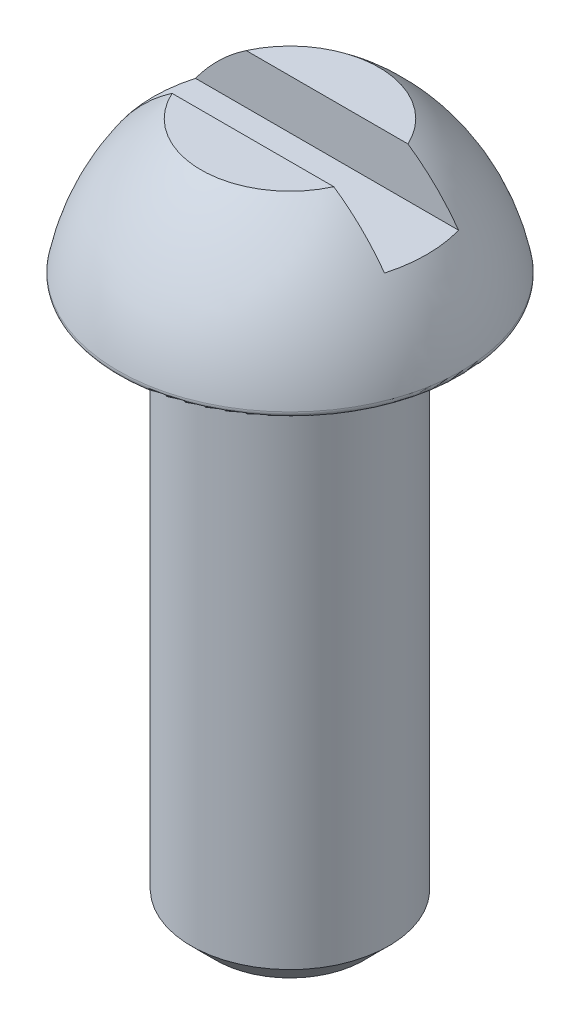
ISO-10303-21;
HEADER;
FILE_DESCRIPTION(('STEP AP214'),'2;1');
FILE_NAME('part.step','',(''),(''),'','','');
FILE_SCHEMA(('AUTOMOTIVE_DESIGN { 1 0 10303 214 1 1 1 1 }'));
ENDSEC;
DATA;
#1=APPLICATION_CONTEXT('core data for automotive mechanical design processes');
#2=APPLICATION_PROTOCOL_DEFINITION('international standard','automotive_design',2000,#1);
#3=PRODUCT_CONTEXT('',#1,'mechanical');
#4=PRODUCT('Part','Part','',(#3));
#5=PRODUCT_RELATED_PRODUCT_CATEGORY('part','',(#4));
#6=PRODUCT_DEFINITION_FORMATION('','',#4);
#7=PRODUCT_DEFINITION_CONTEXT('part definition',#1,'design');
#8=PRODUCT_DEFINITION('design','',#6,#7);
#9=PRODUCT_DEFINITION_SHAPE('','',#8);
#10=(LENGTH_UNIT() NAMED_UNIT(*) SI_UNIT(.MILLI.,.METRE.));
#11=(NAMED_UNIT(*) PLANE_ANGLE_UNIT() SI_UNIT($,.RADIAN.));
#12=(NAMED_UNIT(*) SI_UNIT($,.STERADIAN.) SOLID_ANGLE_UNIT());
#13=UNCERTAINTY_MEASURE_WITH_UNIT(LENGTH_MEASURE(1.E-05),#10,'distance_accuracy_value','');
#14=(GEOMETRIC_REPRESENTATION_CONTEXT(3) GLOBAL_UNCERTAINTY_ASSIGNED_CONTEXT((#13)) GLOBAL_UNIT_ASSIGNED_CONTEXT((#10,
#11,#12)) REPRESENTATION_CONTEXT('',''));
#15=CARTESIAN_POINT('',(0.,0.,0.));
#16=DIRECTION('',(0.,0.,1.));
#17=DIRECTION('',(1.,0.,0.));
#18=AXIS2_PLACEMENT_3D('',#15,#16,#17);
#19=CARTESIAN_POINT('',(0.,14.,0.));
#20=DIRECTION('',(0.,1.,0.));
#21=DIRECTION('',(0.,0.,1.));
#22=AXIS2_PLACEMENT_3D('',#19,#20,#21);
#23=PLANE('',#22);
#24=DIRECTION('',(-1.,0.,0.));
#25=VECTOR('',#24,1.);
#26=CARTESIAN_POINT('',(-4.,14.,-0.75));
#27=LINE('',#26,#25);
#28=CARTESIAN_POINT('',(1.63630681719536,14.,-0.75));
#29=VERTEX_POINT('',#28);
#30=CARTESIAN_POINT('',(-1.63630681719536,14.,-0.75));
#31=VERTEX_POINT('',#30);
#32=EDGE_CURVE('E83',#29,#31,#27,.T.);
#33=ORIENTED_EDGE('',*,*,#32,.F.);
#34=CARTESIAN_POINT('',(0.,14.,0.));
#35=DIRECTION('',(0.,-1.,0.));
#36=DIRECTION('',(0.,0.,-1.));
#37=AXIS2_PLACEMENT_3D('',#34,#35,#36);
#38=CIRCLE('',#37,1.8);
#39=EDGE_CURVE('E90',#31,#29,#38,.T.);
#40=ORIENTED_EDGE('',*,*,#39,.F.);
#41=EDGE_LOOP('',(#33,#40));
#42=FACE_BOUND('',#41,.T.);
#43=ADVANCED_FACE('F29',(#42),#23,.T.);
#44=CARTESIAN_POINT('',(1.5,0.,0.));
#45=DIRECTION('',(0.,-1.,0.));
#46=DIRECTION('',(0.,0.,-1.));
#47=AXIS2_PLACEMENT_3D('',#44,#45,#46);
#48=PLANE('',#47);
#49=CARTESIAN_POINT('',(0.,0.,0.));
#50=DIRECTION('',(0.,-1.,0.));
#51=DIRECTION('',(0.,0.,-1.));
#52=AXIS2_PLACEMENT_3D('',#49,#50,#51);
#53=CIRCLE('',#52,1.5);
#54=CARTESIAN_POINT('',(0.,0.,-1.5));
#55=VERTEX_POINT('',#54);
#56=EDGE_CURVE('E188',#55,#55,#53,.T.);
#57=ORIENTED_EDGE('',*,*,#56,.T.);
#58=EDGE_LOOP('',(#57));
#59=FACE_BOUND('',#58,.T.);
#60=ADVANCED_FACE('F31',(#59),#48,.T.);
#61=DIRECTION('',(1.,0.,0.));
#62=VECTOR('',#61,1.);
#63=CARTESIAN_POINT('',(-4.,14.,0.750000000000001));
#64=LINE('',#63,#62);
#65=CARTESIAN_POINT('',(-1.63630681719536,14.,0.75));
#66=VERTEX_POINT('',#65);
#67=CARTESIAN_POINT('',(1.63630681719536,14.,0.75));
#68=VERTEX_POINT('',#67);
#69=EDGE_CURVE('E74',#66,#68,#64,.T.);
#70=ORIENTED_EDGE('',*,*,#69,.F.);
#71=EDGE_CURVE('E82',#68,#66,#38,.T.);
#72=ORIENTED_EDGE('',*,*,#71,.F.);
#73=EDGE_LOOP('',(#70,#72));
#74=FACE_BOUND('',#73,.T.);
#75=ADVANCED_FACE('F81',(#74),#23,.T.);
#76=CARTESIAN_POINT('',(0.,10.480592167143,0.));
#77=DIRECTION('',(0.,-1.,0.));
#78=DIRECTION('',(0.,0.,-1.));
#79=AXIS2_PLACEMENT_3D('',#76,#77,#78);
#80=DEGENERATE_TOROIDAL_SURFACE('',#79,0.840789371764535,4.4,.F.);
#81=CARTESIAN_POINT('',(0.,14.582956019202,-0.75));
#82=CARTESIAN_POINT('',(-0.0580403365894685,14.5829593395836,-0.75));
#83=CARTESIAN_POINT('',(-0.116075308294297,14.5803208986943,-0.75));
#84=CARTESIAN_POINT('',(-0.231703825295864,14.5700507903085,-0.75));
#85=CARTESIAN_POINT('',(-0.289297267283977,14.5624179882653,-0.75));
#86=CARTESIAN_POINT('',(-0.404014123859632,14.5427255625741,-0.75));
#87=CARTESIAN_POINT('',(-0.461133551541633,14.5306431851174,-0.75));
#88=CARTESIAN_POINT('',(-0.574433896996379,14.5026978582504,-0.75));
#89=CARTESIAN_POINT('',(-0.630614657949977,14.4868342837577,-0.75));
#90=CARTESIAN_POINT('',(-0.77891142804328,14.4402237853859,-0.75));
#91=CARTESIAN_POINT('',(-0.870124449278167,14.4065875640343,-0.75));
#92=CARTESIAN_POINT('',(-1.04941203337837,14.3317851463396,-0.75));
#93=CARTESIAN_POINT('',(-1.13748498224243,14.2906151424381,-0.75));
#94=CARTESIAN_POINT('',(-1.31016932028902,14.201612321418,-0.75));
#95=CARTESIAN_POINT('',(-1.39478152209074,14.1537810801817,-0.75));
#96=CARTESIAN_POINT('',(-1.56027313132481,14.0520265606294,-0.75));
#97=CARTESIAN_POINT('',(-1.64115103467018,13.9981008572434,-0.75));
#98=CARTESIAN_POINT('',(-1.88564150957767,13.8221326577803,-0.75));
#99=CARTESIAN_POINT('',(-2.04242778065091,13.6903970240503,-0.75));
#100=CARTESIAN_POINT('',(-2.33504416247435,13.4057334825201,-0.75));
#101=CARTESIAN_POINT('',(-2.47088393151782,13.252815403923,-0.75));
#102=CARTESIAN_POINT('',(-2.73808918793351,12.9044589140908,-0.75));
#103=CARTESIAN_POINT('',(-2.86566034324544,12.7060883737321,-0.75));
#104=CARTESIAN_POINT('',(-3.08659995570262,12.291014147451,-0.75));
#105=CARTESIAN_POINT('',(-3.17994398310539,12.0742975021984,-0.75));
#106=CARTESIAN_POINT('',(-3.3316107625363,11.6234994690133,-0.75));
#107=CARTESIAN_POINT('',(-3.38910285580516,11.3891379783926,-0.75));
#108=CARTESIAN_POINT('',(-3.46413669819829,10.9141538695774,-0.75));
#109=CARTESIAN_POINT('',(-3.48168471936045,10.6735322403552,-0.75));
#110=CARTESIAN_POINT('',(-3.47636375112643,10.1914653190209,-0.75));
#111=CARTESIAN_POINT('',(-3.45328200753748,9.95002233821973,-0.75));
#112=CARTESIAN_POINT('',(-3.36691092575206,9.47438871675542,-0.75));
#113=CARTESIAN_POINT('',(-3.30361384354493,9.24019948201081,-0.75));
#114=CARTESIAN_POINT('',(-3.13853461690549,8.78576838284434,-0.75));
#115=CARTESIAN_POINT('',(-3.03674780230034,8.56552821472765,-0.75));
#116=CARTESIAN_POINT('',(-2.79748898455758,8.14543434530356,-0.75));
#117=CARTESIAN_POINT('',(-2.66002925682844,7.94557366409833,-0.75));
#118=CARTESIAN_POINT('',(-2.35398331518638,7.57312683166752,-0.75));
#119=CARTESIAN_POINT('',(-2.18556432603752,7.40040298083114,-0.75));
#120=CARTESIAN_POINT('',(-1.82115425247853,7.08622151872324,-0.75));
#121=CARTESIAN_POINT('',(-1.62514447486365,6.94478527377352,-0.75));
#122=CARTESIAN_POINT('',(-1.34776674340392,6.78090232308241,-0.75));
#123=CARTESIAN_POINT('',(-1.27608666405692,6.74151787639481,-0.75));
#124=CARTESIAN_POINT('',(-1.13031662931064,6.66752384040662,-0.75));
#125=CARTESIAN_POINT('',(-1.05622777805294,6.63291210047051,-0.75));
#126=CARTESIAN_POINT('',(-0.905939057170741,6.56903639211666,-0.75));
#127=CARTESIAN_POINT('',(-0.829743756807607,6.53976175661365,-0.75));
#128=CARTESIAN_POINT('',(-0.675322796693611,6.487276486063,-0.75));
#129=CARTESIAN_POINT('',(-0.597097546523169,6.46406463803318,-0.75));
#130=CARTESIAN_POINT('',(-0.400455115570391,6.41559239049113,-0.75));
#131=CARTESIAN_POINT('',(-0.280835490872069,6.39473521709551,-0.75));
#132=CARTESIAN_POINT('',(-0.100258332846962,6.37990687047812,-0.75));
#133=CARTESIAN_POINT('',(-0.0399425862774649,6.37770031288144,-0.75));
#134=CARTESIAN_POINT('',(0.0806433007261477,6.37897042047402,-0.75));
#135=CARTESIAN_POINT('',(0.140913432784944,6.38244795397452,-0.75));
#136=CARTESIAN_POINT('',(0.274323575007443,6.39608509237298,-0.75));
#137=CARTESIAN_POINT('',(0.347326105712831,6.40756561932451,-0.75));
#138=CARTESIAN_POINT('',(0.491980419278101,6.43714756303982,-0.75));
#139=CARTESIAN_POINT('',(0.563631290291078,6.45525329231733,-0.75));
#140=CARTESIAN_POINT('',(0.705783095763594,6.49705377559488,-0.75));
#141=CARTESIAN_POINT('',(0.776273170604393,6.52078500764333,-0.75));
#142=CARTESIAN_POINT('',(0.91545204558301,6.5729729004493,-0.75));
#143=CARTESIAN_POINT('',(0.984141068458322,6.60142897365993,-0.75));
#144=CARTESIAN_POINT('',(1.15197683814272,6.67715387648495,-0.75));
#145=CARTESIAN_POINT('',(1.25000641419588,6.7269178233559,-0.75));
#146=CARTESIAN_POINT('',(1.44148266277653,6.83457435685832,-0.75));
#147=CARTESIAN_POINT('',(1.5349275378867,6.89247009771191,-0.75));
#148=CARTESIAN_POINT('',(1.80720894369679,7.0769572681703,-0.75));
#149=CARTESIAN_POINT('',(1.97867428024067,7.21466444536891,-0.75));
#150=CARTESIAN_POINT('',(2.30057882359354,7.51755979602639,-0.75));
#151=CARTESIAN_POINT('',(2.45061872617133,7.68316879447205,-0.75));
#152=CARTESIAN_POINT('',(2.72303347864184,8.03594995610866,-0.75));
#153=CARTESIAN_POINT('',(2.84538854797858,8.22313739365556,-0.75));
#154=CARTESIAN_POINT('',(3.06694525374409,8.62796552242616,-0.75));
#155=CARTESIAN_POINT('',(3.16393546860489,8.84681977932326,-0.75));
#156=CARTESIAN_POINT('',(3.3202537241883,9.297569556064,-0.75));
#157=CARTESIAN_POINT('',(3.37958124435236,9.52946525611298,-0.75));
#158=CARTESIAN_POINT('',(3.45944916658007,10.0025601142315,-0.75));
#159=CARTESIAN_POINT('',(3.47954221342216,10.2438349406586,-0.75));
#160=CARTESIAN_POINT('',(3.47903920633119,10.7263695468672,-0.75));
#161=CARTESIAN_POINT('',(3.45843779474091,10.9676293204851,-0.75));
#162=CARTESIAN_POINT('',(3.37700227586657,11.4438580710861,-0.75));
#163=CARTESIAN_POINT('',(3.31607248015514,11.6788106998712,-0.75));
#164=CARTESIAN_POINT('',(3.15558147504914,12.1350583184714,-0.75));
#165=CARTESIAN_POINT('',(3.05603087364097,12.35635703928,-0.75));
#166=CARTESIAN_POINT('',(2.82125315986839,12.7785534755014,-0.75));
#167=CARTESIAN_POINT('',(2.68610201750678,12.9794933862572,-0.75));
#168=CARTESIAN_POINT('',(2.38359677259807,13.3556652638098,-0.75));
#169=CARTESIAN_POINT('',(2.21622040763453,13.5308793098386,-0.75));
#170=CARTESIAN_POINT('',(1.85550522686064,13.8482347710406,-0.75));
#171=CARTESIAN_POINT('',(1.66246393917611,13.9907105657179,-0.75));
#172=CARTESIAN_POINT('',(1.35618615550022,14.1766401580921,-0.75));
#173=CARTESIAN_POINT('',(1.25120826348287,14.2340240670664,-0.75));
#174=CARTESIAN_POINT('',(1.03617692562933,14.3383858147761,-0.75));
#175=CARTESIAN_POINT('',(0.926126764483635,14.3853702766773,-0.75));
#176=CARTESIAN_POINT('',(0.748333059865972,14.4498941980304,-0.75));
#177=CARTESIAN_POINT('',(0.68206704463818,14.4715455106505,-0.75));
#178=CARTESIAN_POINT('',(0.548103407540833,14.5099063592771,-0.75));
#179=CARTESIAN_POINT('',(0.480405994813529,14.5266166119508,-0.75));
#180=CARTESIAN_POINT('',(0.344277910119603,14.5540067439061,-0.75));
#181=CARTESIAN_POINT('',(0.27585593405004,14.5647288596414,-0.75));
#182=CARTESIAN_POINT('',(0.138286451791917,14.5791993697233,-0.75));
#183=CARTESIAN_POINT('',(0.0691394194295261,14.5829520638622,-0.75));
#184=CARTESIAN_POINT('',(0.,14.582956019202,-0.75));
#185=B_SPLINE_CURVE_WITH_KNOTS('',3,(#81,#82,#83,#84,#85,#86,#87,#88,#89,#90,#91,#92,#93,#94,
#95,#96,#97,#98,#99,#100,#101,#102,#103,#104,#105,#106,#107,#108,#109,#110,#111,#112,#113,#114,
#115,#116,#117,#118,#119,#120,#121,#122,#123,#124,#125,#126,#127,#128,#129,#130,#131,#132,#133,
#134,#135,#136,#137,#138,#139,#140,#141,#142,#143,#144,#145,#146,#147,#148,#149,#150,#151,#152,
#153,#154,#155,#156,#157,#158,#159,#160,#161,#162,#163,#164,#165,#166,#167,#168,#169,#170,#171,
#172,#173,#174,#175,#176,#177,#178,#179,#180,#181,#182,#183,#184),.UNSPECIFIED.,.T.,.F.,(4,2,2,
2,2,2,2,2,2,2,2,2,2,2,2,2,2,2,2,2,2,2,2,2,2,2,2,2,2,2,2,2,2,2,2,2,2,2,2,2,2,2,2,2,2,2,2,2,2,2,2,
4),(0.,0.174056495817506,0.348152545006498,0.523151520093731,0.698179444943365,
0.989399293553118,1.2807667326379,1.57206535819539,1.86348030631321,2.47536649095358,
3.0869696897974,3.79121267902729,4.49595735040306,5.21647654319957,5.93688259191074,
6.66107221349852,7.38540132993541,8.10981836145929,8.83398644356733,9.55435215458275,
10.2752082953845,10.5204514160815,10.7655836637898,11.0102204705775,11.2548082953121,
11.6172628854862,11.7980871690973,11.9789390783095,12.200253357451,12.4217119527328,
12.6446478738707,12.8675560930527,13.1968979589879,13.5263679271676,14.1830800928446,
14.8507678908608,15.5189312496778,16.2337190110351,16.9485166516853,17.6714179610551,
18.3944144508429,19.1191325965221,19.8436518244594,20.5666373119416,21.2901240693477,
22.0058556355985,22.364350143391,22.7226156731836,22.9316085776758,23.1405711542779,
23.3480406026555,23.5553820099578),.UNSPECIFIED.);
#186=CARTESIAN_POINT('',(-2.66290418993355,13.,-0.75));
#187=VERTEX_POINT('',#186);
#188=EDGE_CURVE('E11',#31,#187,#185,.T.);
#189=ORIENTED_EDGE('',*,*,#188,.F.);
#190=ORIENTED_EDGE('',*,*,#39,.T.);
#191=CARTESIAN_POINT('',(2.66290418993355,13.,-0.75));
#192=VERTEX_POINT('',#191);
#193=EDGE_CURVE('E33',#192,#29,#185,.T.);
#194=ORIENTED_EDGE('',*,*,#193,.F.);
#195=CARTESIAN_POINT('',(0.,13.,0.));
#196=DIRECTION('',(0.,1.,0.));
#197=DIRECTION('',(0.,0.,1.));
#198=AXIS2_PLACEMENT_3D('',#195,#196,#197);
#199=CIRCLE('',#198,2.76650659221438);
#200=CARTESIAN_POINT('',(2.66290418993355,13.,0.75));
#201=VERTEX_POINT('',#200);
#202=EDGE_CURVE('E102',#192,#201,#199,.F.);
#203=ORIENTED_EDGE('',*,*,#202,.T.);
#204=CARTESIAN_POINT('',(0.,14.582956019202,0.75));
#205=CARTESIAN_POINT('',(0.0580403365894685,14.5829593395836,0.75));
#206=CARTESIAN_POINT('',(0.116075308294297,14.5803208986943,0.75));
#207=CARTESIAN_POINT('',(0.231703825295865,14.5700507903085,0.75));
#208=CARTESIAN_POINT('',(0.289297267283977,14.5624179882653,0.75));
#209=CARTESIAN_POINT('',(0.404014123859633,14.5427255625741,0.75));
#210=CARTESIAN_POINT('',(0.461133551541634,14.5306431851174,0.75));
#211=CARTESIAN_POINT('',(0.57443389699638,14.5026978582504,0.75));
#212=CARTESIAN_POINT('',(0.630614657949978,14.4868342837577,0.75));
#213=CARTESIAN_POINT('',(0.77891142804328,14.4402237853859,0.75));
#214=CARTESIAN_POINT('',(0.870124449278167,14.4065875640343,0.75));
#215=CARTESIAN_POINT('',(1.04941203337837,14.3317851463396,0.75));
#216=CARTESIAN_POINT('',(1.13748498224243,14.2906151424381,0.75));
#217=CARTESIAN_POINT('',(1.31016932028902,14.201612321418,0.75));
#218=CARTESIAN_POINT('',(1.39478152209074,14.1537810801817,0.75));
#219=CARTESIAN_POINT('',(1.56027313132481,14.0520265606294,0.75));
#220=CARTESIAN_POINT('',(1.64115103467018,13.9981008572434,0.75));
#221=CARTESIAN_POINT('',(1.88564150957767,13.8221326577803,0.75));
#222=CARTESIAN_POINT('',(2.04242778065091,13.6903970240503,0.75));
#223=CARTESIAN_POINT('',(2.33504416247435,13.4057334825201,0.75));
#224=CARTESIAN_POINT('',(2.47088393151782,13.252815403923,0.75));
#225=CARTESIAN_POINT('',(2.73808918793351,12.9044589140908,0.75));
#226=CARTESIAN_POINT('',(2.86566034324544,12.7060883737321,0.75));
#227=CARTESIAN_POINT('',(3.08659995570262,12.291014147451,0.75));
#228=CARTESIAN_POINT('',(3.17994398310539,12.0742975021984,0.75));
#229=CARTESIAN_POINT('',(3.3316107625363,11.6234994690133,0.75));
#230=CARTESIAN_POINT('',(3.38910285580516,11.3891379783926,0.75));
#231=CARTESIAN_POINT('',(3.46413669819829,10.9141538695774,0.75));
#232=CARTESIAN_POINT('',(3.48168471936045,10.6735322403552,0.75));
#233=CARTESIAN_POINT('',(3.47636375112643,10.1914653190209,0.75));
#234=CARTESIAN_POINT('',(3.45328200753748,9.95002233821973,0.75));
#235=CARTESIAN_POINT('',(3.36691092575206,9.47438871675542,0.75));
#236=CARTESIAN_POINT('',(3.30361384354493,9.24019948201081,0.75));
#237=CARTESIAN_POINT('',(3.13853461690549,8.78576838284434,0.75));
#238=CARTESIAN_POINT('',(3.03674780230034,8.56552821472765,0.75));
#239=CARTESIAN_POINT('',(2.79748898455758,8.14543434530356,0.75));
#240=CARTESIAN_POINT('',(2.66002925682844,7.94557366409833,0.75));
#241=CARTESIAN_POINT('',(2.35398331518638,7.57312683166752,0.75));
#242=CARTESIAN_POINT('',(2.18556432603752,7.40040298083114,0.75));
#243=CARTESIAN_POINT('',(1.82115425247853,7.08622151872324,0.75));
#244=CARTESIAN_POINT('',(1.62514447486365,6.94478527377352,0.75));
#245=CARTESIAN_POINT('',(1.34776674340392,6.78090232308241,0.75));
#246=CARTESIAN_POINT('',(1.27608666405692,6.74151787639481,0.75));
#247=CARTESIAN_POINT('',(1.13031662931064,6.66752384040662,0.75));
#248=CARTESIAN_POINT('',(1.05622777805294,6.63291210047051,0.75));
#249=CARTESIAN_POINT('',(0.905939057170741,6.56903639211665,0.75));
#250=CARTESIAN_POINT('',(0.829743756807607,6.53976175661365,0.75));
#251=CARTESIAN_POINT('',(0.675322796693611,6.487276486063,0.75));
#252=CARTESIAN_POINT('',(0.597097546523169,6.46406463803318,0.75));
#253=CARTESIAN_POINT('',(0.40045511557039,6.41559239049113,0.75));
#254=CARTESIAN_POINT('',(0.280835490872069,6.39473521709551,0.75));
#255=CARTESIAN_POINT('',(0.100258332846961,6.37990687047812,0.75));
#256=CARTESIAN_POINT('',(0.0399425862774647,6.37770031288144,0.75));
#257=CARTESIAN_POINT('',(-0.0806433007261479,6.37897042047402,0.75));
#258=CARTESIAN_POINT('',(-0.140913432784944,6.38244795397452,0.75));
#259=CARTESIAN_POINT('',(-0.274323575007443,6.39608509237298,0.75));
#260=CARTESIAN_POINT('',(-0.347326105712832,6.40756561932451,0.75));
#261=CARTESIAN_POINT('',(-0.491980419278101,6.43714756303982,0.75));
#262=CARTESIAN_POINT('',(-0.563631290291079,6.45525329231733,0.75));
#263=CARTESIAN_POINT('',(-0.705783095763594,6.49705377559488,0.75));
#264=CARTESIAN_POINT('',(-0.776273170604393,6.52078500764333,0.75));
#265=CARTESIAN_POINT('',(-0.91545204558301,6.5729729004493,0.75));
#266=CARTESIAN_POINT('',(-0.984141068458322,6.60142897365993,0.75));
#267=CARTESIAN_POINT('',(-1.15197683814272,6.67715387648495,0.75));
#268=CARTESIAN_POINT('',(-1.25000641419588,6.7269178233559,0.75));
#269=CARTESIAN_POINT('',(-1.44148266277653,6.83457435685832,0.75));
#270=CARTESIAN_POINT('',(-1.53492753788671,6.89247009771191,0.75));
#271=CARTESIAN_POINT('',(-1.80720894369679,7.0769572681703,0.75));
#272=CARTESIAN_POINT('',(-1.97867428024067,7.21466444536891,0.75));
#273=CARTESIAN_POINT('',(-2.30057882359354,7.51755979602639,0.75));
#274=CARTESIAN_POINT('',(-2.45061872617133,7.68316879447205,0.75));
#275=CARTESIAN_POINT('',(-2.72303347864184,8.03594995610866,0.75));
#276=CARTESIAN_POINT('',(-2.84538854797858,8.22313739365556,0.75));
#277=CARTESIAN_POINT('',(-3.0669452537441,8.62796552242616,0.75));
#278=CARTESIAN_POINT('',(-3.16393546860489,8.84681977932326,0.75));
#279=CARTESIAN_POINT('',(-3.3202537241883,9.297569556064,0.75));
#280=CARTESIAN_POINT('',(-3.37958124435236,9.52946525611298,0.75));
#281=CARTESIAN_POINT('',(-3.45944916658007,10.0025601142315,0.75));
#282=CARTESIAN_POINT('',(-3.47954221342216,10.2438349406586,0.75));
#283=CARTESIAN_POINT('',(-3.47903920633119,10.7263695468672,0.75));
#284=CARTESIAN_POINT('',(-3.45843779474091,10.9676293204851,0.75));
#285=CARTESIAN_POINT('',(-3.37700227586657,11.4438580710861,0.75));
#286=CARTESIAN_POINT('',(-3.31607248015514,11.6788106998712,0.75));
#287=CARTESIAN_POINT('',(-3.15558147504914,12.1350583184714,0.75));
#288=CARTESIAN_POINT('',(-3.05603087364097,12.35635703928,0.75));
#289=CARTESIAN_POINT('',(-2.82125315986839,12.7785534755014,0.75));
#290=CARTESIAN_POINT('',(-2.68610201750677,12.9794933862572,0.75));
#291=CARTESIAN_POINT('',(-2.38359677259806,13.3556652638098,0.75));
#292=CARTESIAN_POINT('',(-2.21622040763452,13.5308793098386,0.75));
#293=CARTESIAN_POINT('',(-1.85550522686063,13.8482347710406,0.75));
#294=CARTESIAN_POINT('',(-1.66246393917611,13.9907105657179,0.75));
#295=CARTESIAN_POINT('',(-1.35618615550022,14.1766401580921,0.75));
#296=CARTESIAN_POINT('',(-1.25120826348287,14.2340240670664,0.75));
#297=CARTESIAN_POINT('',(-1.03617692562933,14.3383858147761,0.75));
#298=CARTESIAN_POINT('',(-0.926126764483635,14.3853702766773,0.75));
#299=CARTESIAN_POINT('',(-0.748333059865972,14.4498941980304,0.75));
#300=CARTESIAN_POINT('',(-0.682067044638181,14.4715455106505,0.75));
#301=CARTESIAN_POINT('',(-0.548103407540834,14.5099063592771,0.75));
#302=CARTESIAN_POINT('',(-0.480405994813531,14.5266166119508,0.75));
#303=CARTESIAN_POINT('',(-0.344277910119603,14.5540067439061,0.75));
#304=CARTESIAN_POINT('',(-0.27585593405004,14.5647288596414,0.75));
#305=CARTESIAN_POINT('',(-0.138286451791917,14.5791993697233,0.75));
#306=CARTESIAN_POINT('',(-0.0691394194295258,14.5829520638622,0.75));
#307=CARTESIAN_POINT('',(0.,14.582956019202,0.75));
#308=B_SPLINE_CURVE_WITH_KNOTS('',3,(#204,#205,#206,#207,#208,#209,#210,#211,#212,#213,#214,
#215,#216,#217,#218,#219,#220,#221,#222,#223,#224,#225,#226,#227,#228,#229,#230,#231,#232,#233,
#234,#235,#236,#237,#238,#239,#240,#241,#242,#243,#244,#245,#246,#247,#248,#249,#250,#251,#252,
#253,#254,#255,#256,#257,#258,#259,#260,#261,#262,#263,#264,#265,#266,#267,#268,#269,#270,#271,
#272,#273,#274,#275,#276,#277,#278,#279,#280,#281,#282,#283,#284,#285,#286,#287,#288,#289,#290,
#291,#292,#293,#294,#295,#296,#297,#298,#299,#300,#301,#302,#303,#304,#305,#306,#307),
.UNSPECIFIED.,.T.,.F.,(4,2,2,2,2,2,2,2,2,2,2,2,2,2,2,2,2,2,2,2,2,2,2,2,2,2,2,2,2,2,2,2,2,2,2,2,
2,2,2,2,2,2,2,2,2,2,2,2,2,2,2,4),(0.,0.174056495817506,0.348152545006498,0.523151520093731,
0.698179444943365,0.989399293553118,1.2807667326379,1.5720653581954,1.86348030631321,
2.47536649095358,3.0869696897974,3.79121267902729,4.49595735040306,5.21647654319957,
5.93688259191074,6.66107221349852,7.38540132993541,8.10981836145929,8.83398644356733,
9.55435215458275,10.2752082953845,10.5204514160815,10.7655836637898,11.0102204705775,
11.2548082953121,11.6172628854862,11.7980871690973,11.9789390783095,12.200253357451,
12.4217119527328,12.6446478738707,12.8675560930527,13.1968979589879,13.5263679271676,
14.1830800928446,14.8507678908608,15.5189312496778,16.2337190110351,16.9485166516853,
17.6714179610551,18.3944144508429,19.1191325965221,19.8436518244594,20.5666373119416,
21.2901240693477,22.0058556355985,22.364350143391,22.7226156731836,22.9316085776758,
23.1405711542779,23.3480406026555,23.5553820099578),.UNSPECIFIED.);
#309=EDGE_CURVE('E78',#68,#201,#308,.T.);
#310=ORIENTED_EDGE('',*,*,#309,.F.);
#311=ORIENTED_EDGE('',*,*,#71,.T.);
#312=CARTESIAN_POINT('',(-2.66290418993355,13.,0.75));
#313=VERTEX_POINT('',#312);
#314=EDGE_CURVE('E42',#313,#66,#308,.T.);
#315=ORIENTED_EDGE('',*,*,#314,.F.);
#316=EDGE_CURVE('E54',#313,#187,#199,.F.);
#317=ORIENTED_EDGE('',*,*,#316,.T.);
#318=EDGE_LOOP('',(#189,#190,#194,#203,#310,#311,#315,#317));
#319=FACE_BOUND('',#318,.T.);
#320=CARTESIAN_POINT('',(0.,11.319055996113,0.));
#321=DIRECTION('',(0.,-1.,0.));
#322=DIRECTION('',(0.,0.,-1.));
#323=AXIS2_PLACEMENT_3D('',#320,#321,#322);
#324=CIRCLE('',#323,3.47858308352443);
#325=CARTESIAN_POINT('',(0.,11.319055996113,-3.47858308352443));
#326=VERTEX_POINT('',#325);
#327=EDGE_CURVE('E93',#326,#326,#324,.F.);
#328=ORIENTED_EDGE('',*,*,#327,.T.);
#329=EDGE_LOOP('',(#328));
#330=FACE_BOUND('',#329,.T.);
#331=ADVANCED_FACE('F86',(#319,#330),#80,.F.);
#332=CARTESIAN_POINT('',(3.5,11.2,0.));
#333=DIRECTION('',(0.,-1.,0.));
#334=DIRECTION('',(0.,0.,-1.));
#335=AXIS2_PLACEMENT_3D('',#332,#333,#334);
#336=PLANE('',#335);
#337=CARTESIAN_POINT('',(0.,11.2,0.));
#338=DIRECTION('',(0.,-1.,0.));
#339=DIRECTION('',(0.,0.,-1.));
#340=AXIS2_PLACEMENT_3D('',#337,#338,#339);
#341=CIRCLE('',#340,3.3804155277224);
#342=CARTESIAN_POINT('',(0.,11.2,-3.3804155277224));
#343=VERTEX_POINT('',#342);
#344=EDGE_CURVE('E89',#343,#343,#341,.T.);
#345=ORIENTED_EDGE('',*,*,#344,.T.);
#346=EDGE_LOOP('',(#345));
#347=FACE_BOUND('',#346,.T.);
#348=CARTESIAN_POINT('',(0.,11.2,0.));
#349=DIRECTION('',(0.,-1.,0.));
#350=DIRECTION('',(0.,0.,-1.));
#351=AXIS2_PLACEMENT_3D('',#348,#349,#350);
#352=CIRCLE('',#351,2.);
#353=CARTESIAN_POINT('',(0.,11.2,-2.));
#354=VERTEX_POINT('',#353);
#355=EDGE_CURVE('E96',#354,#354,#352,.T.);
#356=ORIENTED_EDGE('',*,*,#355,.F.);
#357=EDGE_LOOP('',(#356));
#358=FACE_BOUND('',#357,.T.);
#359=ADVANCED_FACE('F125',(#347,#358),#336,.T.);
#360=CARTESIAN_POINT('',(0.,0.,0.));
#361=DIRECTION('',(0.,-1.,0.));
#362=DIRECTION('',(0.,0.,-1.));
#363=AXIS2_PLACEMENT_3D('',#360,#361,#362);
#364=CYLINDRICAL_SURFACE('',#363,2.);
#365=ORIENTED_EDGE('',*,*,#355,.T.);
#366=EDGE_LOOP('',(#365));
#367=FACE_BOUND('',#366,.T.);
#368=CARTESIAN_POINT('',(0.,0.500000000000003,0.));
#369=DIRECTION('',(0.,-1.,0.));
#370=DIRECTION('',(0.,0.,-1.));
#371=AXIS2_PLACEMENT_3D('',#368,#369,#370);
#372=CIRCLE('',#371,2.);
#373=CARTESIAN_POINT('',(0.,0.500000000000003,-2.));
#374=VERTEX_POINT('',#373);
#375=EDGE_CURVE('E194',#374,#374,#372,.T.);
#376=ORIENTED_EDGE('',*,*,#375,.F.);
#377=EDGE_LOOP('',(#376));
#378=FACE_BOUND('',#377,.T.);
#379=ADVANCED_FACE('F122',(#367,#378),#364,.T.);
#380=CARTESIAN_POINT('',(0.,0.,0.));
#381=DIRECTION('',(0.,1.,0.));
#382=DIRECTION('',(0.,0.,1.));
#383=AXIS2_PLACEMENT_3D('',#380,#381,#382);
#384=CONICAL_SURFACE('',#383,1.5,0.785398163397445);
#385=ORIENTED_EDGE('',*,*,#375,.T.);
#386=EDGE_LOOP('',(#385));
#387=FACE_BOUND('',#386,.T.);
#388=ORIENTED_EDGE('',*,*,#56,.F.);
#389=EDGE_LOOP('',(#388));
#390=FACE_BOUND('',#389,.T.);
#391=ADVANCED_FACE('F118',(#387,#390),#384,.T.);
#392=CARTESIAN_POINT('',(0.,11.3,0.));
#393=DIRECTION('',(0.,-1.,0.));
#394=DIRECTION('',(0.,0.,-1.));
#395=AXIS2_PLACEMENT_3D('',#392,#393,#394);
#396=TOROIDAL_SURFACE('',#395,3.3804155277224,0.1);
#397=ORIENTED_EDGE('',*,*,#327,.F.);
#398=EDGE_LOOP('',(#397));
#399=FACE_BOUND('',#398,.T.);
#400=ORIENTED_EDGE('',*,*,#344,.F.);
#401=EDGE_LOOP('',(#400));
#402=FACE_BOUND('',#401,.T.);
#403=ADVANCED_FACE('F115',(#399,#402),#396,.T.);
#404=CARTESIAN_POINT('',(-4.,13.,-0.75));
#405=DIRECTION('',(0.,0.,-1.));
#406=DIRECTION('',(-1.,0.,0.));
#407=AXIS2_PLACEMENT_3D('',#404,#405,#406);
#408=PLANE('',#407);
#409=ORIENTED_EDGE('',*,*,#188,.T.);
#410=DIRECTION('',(-1.,0.,0.));
#411=VECTOR('',#410,1.);
#412=CARTESIAN_POINT('',(-4.,13.,-0.75));
#413=LINE('',#412,#411);
#414=EDGE_CURVE('E185',#192,#187,#413,.T.);
#415=ORIENTED_EDGE('',*,*,#414,.F.);
#416=ORIENTED_EDGE('',*,*,#193,.T.);
#417=ORIENTED_EDGE('',*,*,#32,.T.);
#418=EDGE_LOOP('',(#409,#415,#416,#417));
#419=FACE_BOUND('',#418,.T.);
#420=ADVANCED_FACE('F112',(#419),#408,.F.);
#421=CARTESIAN_POINT('',(-4.,13.,0.750000000000001));
#422=DIRECTION('',(0.,0.,1.));
#423=DIRECTION('',(1.,0.,0.));
#424=AXIS2_PLACEMENT_3D('',#421,#422,#423);
#425=PLANE('',#424);
#426=ORIENTED_EDGE('',*,*,#309,.T.);
#427=DIRECTION('',(1.,0.,0.));
#428=VECTOR('',#427,1.);
#429=CARTESIAN_POINT('',(-4.,13.,0.750000000000001));
#430=LINE('',#429,#428);
#431=EDGE_CURVE('E49',#313,#201,#430,.T.);
#432=ORIENTED_EDGE('',*,*,#431,.F.);
#433=ORIENTED_EDGE('',*,*,#314,.T.);
#434=ORIENTED_EDGE('',*,*,#69,.T.);
#435=EDGE_LOOP('',(#426,#432,#433,#434));
#436=FACE_BOUND('',#435,.T.);
#437=ADVANCED_FACE('F73',(#436),#425,.F.);
#438=CARTESIAN_POINT('',(-4.,13.,-0.75));
#439=DIRECTION('',(0.,1.,0.));
#440=DIRECTION('',(0.,0.,1.));
#441=AXIS2_PLACEMENT_3D('',#438,#439,#440);
#442=PLANE('',#441);
#443=ORIENTED_EDGE('',*,*,#431,.T.);
#444=ORIENTED_EDGE('',*,*,#202,.F.);
#445=ORIENTED_EDGE('',*,*,#414,.T.);
#446=ORIENTED_EDGE('',*,*,#316,.F.);
#447=EDGE_LOOP('',(#443,#444,#445,#446));
#448=FACE_BOUND('',#447,.T.);
#449=ADVANCED_FACE('F111',(#448),#442,.T.);
#450=CLOSED_SHELL('',(#43,#60,#75,#331,#359,#379,#391,#403,#420,#437,#449));
#451=MANIFOLD_SOLID_BREP('B2',#450);
#452=ADVANCED_BREP_SHAPE_REPRESENTATION('',(#18,#451),#14);
#453=SHAPE_DEFINITION_REPRESENTATION(#9,#452);
ENDSEC;
END-ISO-10303-21;
